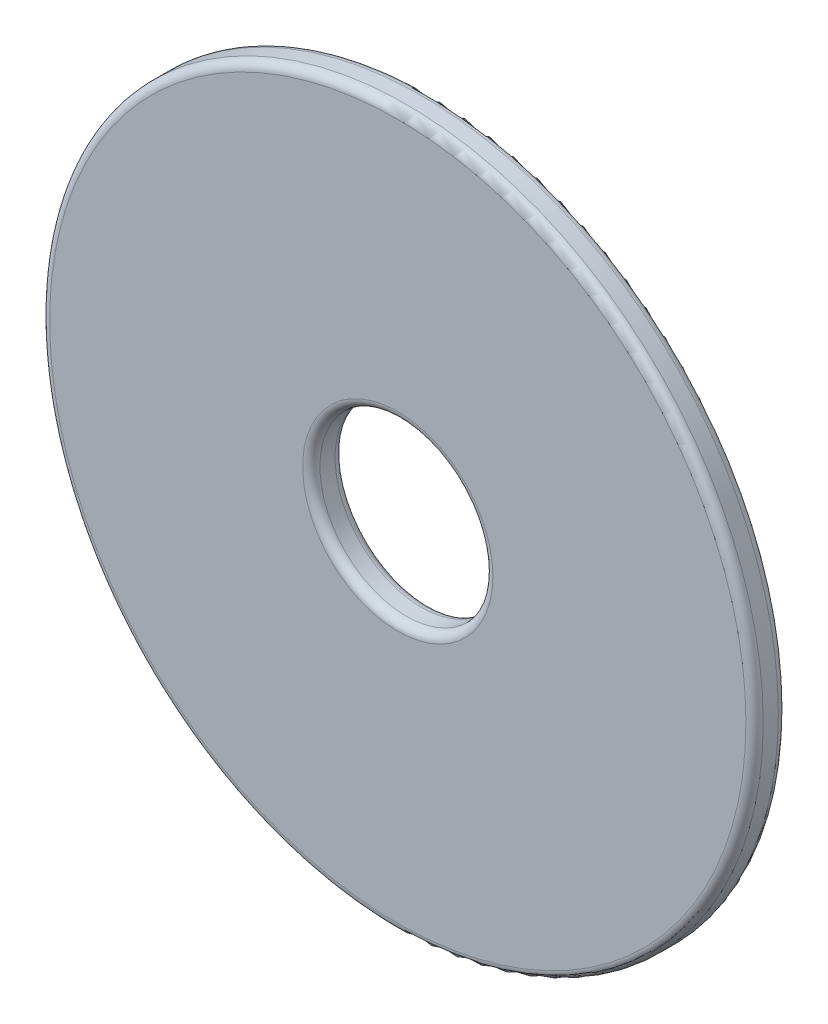
ISO-10303-21;
HEADER;
FILE_DESCRIPTION(('STEP AP214'),'2;1');
FILE_NAME('part.step','',(''),(''),'','','');
FILE_SCHEMA(('AUTOMOTIVE_DESIGN { 1 0 10303 214 1 1 1 1 }'));
ENDSEC;
DATA;
#1=APPLICATION_CONTEXT('core data for automotive mechanical design processes');
#2=APPLICATION_PROTOCOL_DEFINITION('international standard','automotive_design',2000,#1);
#3=PRODUCT_CONTEXT('',#1,'mechanical');
#4=PRODUCT('Part','Part','',(#3));
#5=PRODUCT_RELATED_PRODUCT_CATEGORY('part','',(#4));
#6=PRODUCT_DEFINITION_FORMATION('','',#4);
#7=PRODUCT_DEFINITION_CONTEXT('part definition',#1,'design');
#8=PRODUCT_DEFINITION('design','',#6,#7);
#9=PRODUCT_DEFINITION_SHAPE('','',#8);
#10=(LENGTH_UNIT() NAMED_UNIT(*) SI_UNIT(.MILLI.,.METRE.));
#11=(NAMED_UNIT(*) PLANE_ANGLE_UNIT() SI_UNIT($,.RADIAN.));
#12=(NAMED_UNIT(*) SI_UNIT($,.STERADIAN.) SOLID_ANGLE_UNIT());
#13=UNCERTAINTY_MEASURE_WITH_UNIT(LENGTH_MEASURE(1.E-05),#10,'distance_accuracy_value','');
#14=(GEOMETRIC_REPRESENTATION_CONTEXT(3) GLOBAL_UNCERTAINTY_ASSIGNED_CONTEXT((#13)) GLOBAL_UNIT_ASSIGNED_CONTEXT((#10,
#11,#12)) REPRESENTATION_CONTEXT('',''));
#15=CARTESIAN_POINT('',(0.,0.,0.));
#16=DIRECTION('',(0.,0.,1.));
#17=DIRECTION('',(1.,0.,0.));
#18=AXIS2_PLACEMENT_3D('',#15,#16,#17);
#19=CARTESIAN_POINT('',(0.,0.,0.75));
#20=DIRECTION('',(0.,0.,1.));
#21=DIRECTION('',(1.,0.,0.));
#22=AXIS2_PLACEMENT_3D('',#19,#20,#21);
#23=PLANE('',#22);
#24=CARTESIAN_POINT('',(0.,0.,0.75));
#25=DIRECTION('',(0.,0.,1.));
#26=DIRECTION('',(1.,0.,0.));
#27=AXIS2_PLACEMENT_3D('',#24,#25,#26);
#28=CIRCLE('',#27,2.2);
#29=CARTESIAN_POINT('',(2.2,0.,0.75));
#30=VERTEX_POINT('',#29);
#31=EDGE_CURVE('E10',#30,#30,#28,.F.);
#32=ORIENTED_EDGE('',*,*,#31,.T.);
#33=EDGE_LOOP('',(#32));
#34=FACE_BOUND('',#33,.T.);
#35=CARTESIAN_POINT('',(0.,0.,0.75));
#36=DIRECTION('',(0.,0.,1.));
#37=DIRECTION('',(1.,0.,0.));
#38=AXIS2_PLACEMENT_3D('',#35,#36,#37);
#39=CIRCLE('',#38,8.05);
#40=CARTESIAN_POINT('',(8.05,0.,0.75));
#41=VERTEX_POINT('',#40);
#42=EDGE_CURVE('E38',#41,#41,#39,.T.);
#43=ORIENTED_EDGE('',*,*,#42,.T.);
#44=EDGE_LOOP('',(#43));
#45=FACE_BOUND('',#44,.T.);
#46=ADVANCED_FACE('F31',(#34,#45),#23,.T.);
#47=CARTESIAN_POINT('',(0.,0.,0.));
#48=DIRECTION('',(0.,0.,1.));
#49=DIRECTION('',(1.,0.,0.));
#50=AXIS2_PLACEMENT_3D('',#47,#48,#49);
#51=PLANE('',#50);
#52=CARTESIAN_POINT('',(0.,0.,0.));
#53=DIRECTION('',(0.,0.,1.));
#54=DIRECTION('',(1.,0.,0.));
#55=AXIS2_PLACEMENT_3D('',#52,#53,#54);
#56=CIRCLE('',#55,2.2);
#57=CARTESIAN_POINT('',(2.2,0.,0.));
#58=VERTEX_POINT('',#57);
#59=EDGE_CURVE('E57',#58,#58,#56,.T.);
#60=ORIENTED_EDGE('',*,*,#59,.T.);
#61=EDGE_LOOP('',(#60));
#62=FACE_BOUND('',#61,.T.);
#63=CARTESIAN_POINT('',(0.,0.,0.));
#64=DIRECTION('',(0.,0.,1.));
#65=DIRECTION('',(1.,0.,0.));
#66=AXIS2_PLACEMENT_3D('',#63,#64,#65);
#67=CIRCLE('',#66,8.05);
#68=CARTESIAN_POINT('',(8.05,0.,0.));
#69=VERTEX_POINT('',#68);
#70=EDGE_CURVE('E60',#69,#69,#67,.F.);
#71=ORIENTED_EDGE('',*,*,#70,.T.);
#72=EDGE_LOOP('',(#71));
#73=FACE_BOUND('',#72,.T.);
#74=ADVANCED_FACE('F64',(#62,#73),#51,.F.);
#75=CARTESIAN_POINT('',(0.,0.,0.75));
#76=DIRECTION('',(0.,0.,-1.));
#77=DIRECTION('',(-1.,0.,0.));
#78=AXIS2_PLACEMENT_3D('',#75,#76,#77);
#79=CYLINDRICAL_SURFACE('',#78,8.25);
#80=CARTESIAN_POINT('',(0.,0.,0.2));
#81=DIRECTION('',(0.,0.,1.));
#82=DIRECTION('',(1.,0.,0.));
#83=AXIS2_PLACEMENT_3D('',#80,#81,#82);
#84=CIRCLE('',#83,8.25);
#85=CARTESIAN_POINT('',(8.25,0.,0.2));
#86=VERTEX_POINT('',#85);
#87=EDGE_CURVE('E42',#86,#86,#84,.T.);
#88=ORIENTED_EDGE('',*,*,#87,.T.);
#89=EDGE_LOOP('',(#88));
#90=FACE_BOUND('',#89,.T.);
#91=CARTESIAN_POINT('',(0.,0.,0.55));
#92=DIRECTION('',(0.,0.,1.));
#93=DIRECTION('',(1.,0.,0.));
#94=AXIS2_PLACEMENT_3D('',#91,#92,#93);
#95=CIRCLE('',#94,8.25);
#96=CARTESIAN_POINT('',(8.25,0.,0.55));
#97=VERTEX_POINT('',#96);
#98=EDGE_CURVE('E46',#97,#97,#95,.F.);
#99=ORIENTED_EDGE('',*,*,#98,.T.);
#100=EDGE_LOOP('',(#99));
#101=FACE_BOUND('',#100,.T.);
#102=ADVANCED_FACE('F33',(#90,#101),#79,.T.);
#103=CARTESIAN_POINT('',(0.,0.,0.75));
#104=DIRECTION('',(0.,0.,-1.));
#105=DIRECTION('',(-1.,0.,0.));
#106=AXIS2_PLACEMENT_3D('',#103,#104,#105);
#107=CYLINDRICAL_SURFACE('',#106,2.);
#108=CARTESIAN_POINT('',(0.,0.,0.2));
#109=DIRECTION('',(0.,0.,1.));
#110=DIRECTION('',(1.,0.,0.));
#111=AXIS2_PLACEMENT_3D('',#108,#109,#110);
#112=CIRCLE('',#111,2.);
#113=CARTESIAN_POINT('',(2.,0.,0.2));
#114=VERTEX_POINT('',#113);
#115=EDGE_CURVE('E51',#114,#114,#112,.F.);
#116=ORIENTED_EDGE('',*,*,#115,.T.);
#117=EDGE_LOOP('',(#116));
#118=FACE_BOUND('',#117,.T.);
#119=CARTESIAN_POINT('',(0.,0.,0.55));
#120=DIRECTION('',(0.,0.,1.));
#121=DIRECTION('',(1.,0.,0.));
#122=AXIS2_PLACEMENT_3D('',#119,#120,#121);
#123=CIRCLE('',#122,2.);
#124=CARTESIAN_POINT('',(2.,0.,0.55));
#125=VERTEX_POINT('',#124);
#126=EDGE_CURVE('E54',#125,#125,#123,.T.);
#127=ORIENTED_EDGE('',*,*,#126,.T.);
#128=EDGE_LOOP('',(#127));
#129=FACE_BOUND('',#128,.T.);
#130=ADVANCED_FACE('F76',(#118,#129),#107,.F.);
#131=CARTESIAN_POINT('',(0.,0.,0.2));
#132=DIRECTION('',(0.,0.,1.));
#133=DIRECTION('',(1.,0.,0.));
#134=AXIS2_PLACEMENT_3D('',#131,#132,#133);
#135=TOROIDAL_SURFACE('',#134,2.2,0.2);
#136=ORIENTED_EDGE('',*,*,#115,.F.);
#137=EDGE_LOOP('',(#136));
#138=FACE_BOUND('',#137,.T.);
#139=ORIENTED_EDGE('',*,*,#59,.F.);
#140=EDGE_LOOP('',(#139));
#141=FACE_BOUND('',#140,.T.);
#142=ADVANCED_FACE('F70',(#138,#141),#135,.T.);
#143=CARTESIAN_POINT('',(0.,0.,0.2));
#144=DIRECTION('',(0.,0.,1.));
#145=DIRECTION('',(1.,0.,0.));
#146=AXIS2_PLACEMENT_3D('',#143,#144,#145);
#147=TOROIDAL_SURFACE('',#146,8.05,0.2);
#148=ORIENTED_EDGE('',*,*,#70,.F.);
#149=EDGE_LOOP('',(#148));
#150=FACE_BOUND('',#149,.T.);
#151=ORIENTED_EDGE('',*,*,#87,.F.);
#152=EDGE_LOOP('',(#151));
#153=FACE_BOUND('',#152,.T.);
#154=ADVANCED_FACE('F66',(#150,#153),#147,.T.);
#155=CARTESIAN_POINT('',(0.,0.,0.55));
#156=DIRECTION('',(0.,0.,1.));
#157=DIRECTION('',(1.,0.,0.));
#158=AXIS2_PLACEMENT_3D('',#155,#156,#157);
#159=TOROIDAL_SURFACE('',#158,2.2,0.2);
#160=ORIENTED_EDGE('',*,*,#31,.F.);
#161=EDGE_LOOP('',(#160));
#162=FACE_BOUND('',#161,.T.);
#163=ORIENTED_EDGE('',*,*,#126,.F.);
#164=EDGE_LOOP('',(#163));
#165=FACE_BOUND('',#164,.T.);
#166=ADVANCED_FACE('F69',(#162,#165),#159,.T.);
#167=CARTESIAN_POINT('',(0.,0.,0.55));
#168=DIRECTION('',(0.,0.,1.));
#169=DIRECTION('',(1.,0.,0.));
#170=AXIS2_PLACEMENT_3D('',#167,#168,#169);
#171=TOROIDAL_SURFACE('',#170,8.05,0.2);
#172=ORIENTED_EDGE('',*,*,#98,.F.);
#173=EDGE_LOOP('',(#172));
#174=FACE_BOUND('',#173,.T.);
#175=ORIENTED_EDGE('',*,*,#42,.F.);
#176=EDGE_LOOP('',(#175));
#177=FACE_BOUND('',#176,.T.);
#178=ADVANCED_FACE('F79',(#174,#177),#171,.T.);
#179=CLOSED_SHELL('',(#46,#74,#102,#130,#142,#154,#166,#178));
#180=MANIFOLD_SOLID_BREP('B2',#179);
#181=ADVANCED_BREP_SHAPE_REPRESENTATION('',(#18,#180),#14);
#182=SHAPE_DEFINITION_REPRESENTATION(#9,#181);
ENDSEC;
END-ISO-10303-21;
